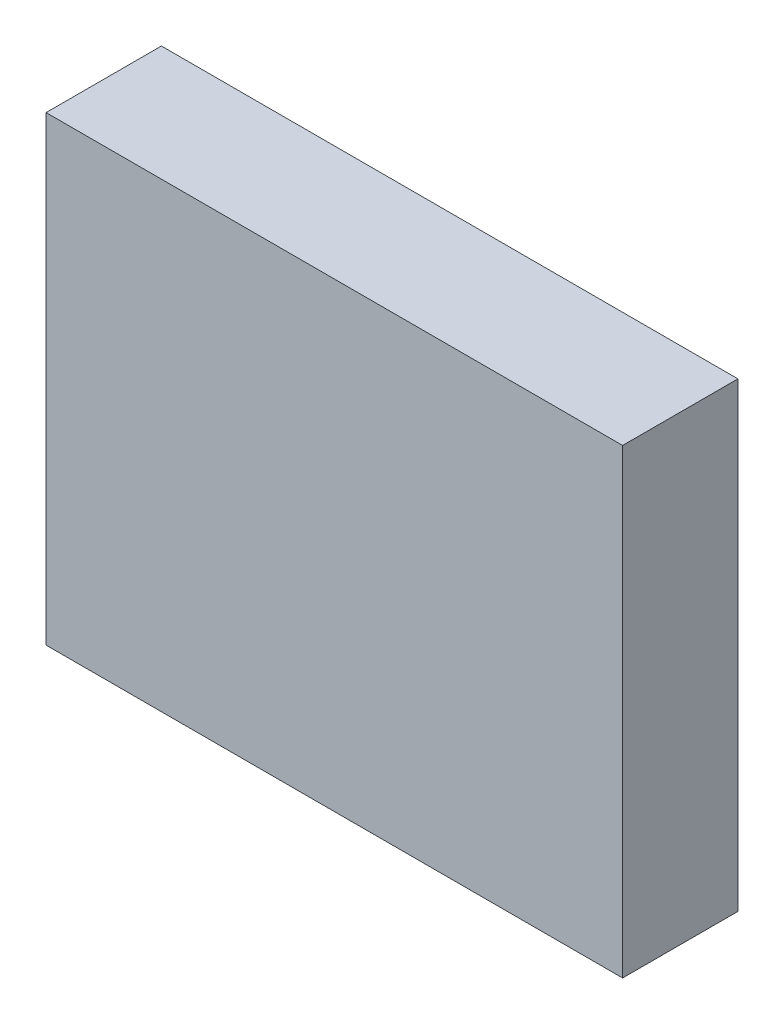
ISO-10303-21;
HEADER;
FILE_DESCRIPTION(('STEP AP214'),'2;1');
FILE_NAME('part.step','',(''),(''),'','','');
FILE_SCHEMA(('AUTOMOTIVE_DESIGN { 1 0 10303 214 1 1 1 1 }'));
ENDSEC;
DATA;
#1=APPLICATION_CONTEXT('core data for automotive mechanical design processes');
#2=APPLICATION_PROTOCOL_DEFINITION('international standard','automotive_design',2000,#1);
#3=PRODUCT_CONTEXT('',#1,'mechanical');
#4=PRODUCT('Part','Part','',(#3));
#5=PRODUCT_RELATED_PRODUCT_CATEGORY('part','',(#4));
#6=PRODUCT_DEFINITION_FORMATION('','',#4);
#7=PRODUCT_DEFINITION_CONTEXT('part definition',#1,'design');
#8=PRODUCT_DEFINITION('design','',#6,#7);
#9=PRODUCT_DEFINITION_SHAPE('','',#8);
#10=(LENGTH_UNIT() NAMED_UNIT(*) SI_UNIT(.MILLI.,.METRE.));
#11=(NAMED_UNIT(*) PLANE_ANGLE_UNIT() SI_UNIT($,.RADIAN.));
#12=(NAMED_UNIT(*) SI_UNIT($,.STERADIAN.) SOLID_ANGLE_UNIT());
#13=UNCERTAINTY_MEASURE_WITH_UNIT(LENGTH_MEASURE(1.E-05),#10,'distance_accuracy_value','');
#14=(GEOMETRIC_REPRESENTATION_CONTEXT(3) GLOBAL_UNCERTAINTY_ASSIGNED_CONTEXT((#13)) GLOBAL_UNIT_ASSIGNED_CONTEXT((#10,
#11,#12)) REPRESENTATION_CONTEXT('',''));
#15=CARTESIAN_POINT('',(0.,0.,0.));
#16=DIRECTION('',(0.,0.,1.));
#17=DIRECTION('',(1.,0.,0.));
#18=AXIS2_PLACEMENT_3D('',#15,#16,#17);
#19=CARTESIAN_POINT('',(0.,0.,100.));
#20=DIRECTION('',(1.,0.,0.));
#21=DIRECTION('',(0.,1.,0.));
#22=AXIS2_PLACEMENT_3D('',#19,#20,#21);
#23=PLANE('',#22);
#24=DIRECTION('',(0.,-1.,0.));
#25=VECTOR('',#24,1.);
#26=CARTESIAN_POINT('',(0.,0.,0.));
#27=LINE('',#26,#25);
#28=CARTESIAN_POINT('',(0.,0.,0.));
#29=VERTEX_POINT('',#28);
#30=CARTESIAN_POINT('',(0.,-400.,0.));
#31=VERTEX_POINT('',#30);
#32=EDGE_CURVE('E113',#29,#31,#27,.T.);
#33=ORIENTED_EDGE('',*,*,#32,.T.);
#34=DIRECTION('',(0.,0.,-1.));
#35=VECTOR('',#34,1.);
#36=CARTESIAN_POINT('',(0.,-400.,100.));
#37=LINE('',#36,#35);
#38=CARTESIAN_POINT('',(0.,-400.,100.));
#39=VERTEX_POINT('',#38);
#40=EDGE_CURVE('E11',#39,#31,#37,.T.);
#41=ORIENTED_EDGE('',*,*,#40,.F.);
#42=DIRECTION('',(0.,-1.,0.));
#43=VECTOR('',#42,1.);
#44=CARTESIAN_POINT('',(0.,0.,100.));
#45=LINE('',#44,#43);
#46=CARTESIAN_POINT('',(0.,0.,100.));
#47=VERTEX_POINT('',#46);
#48=EDGE_CURVE('E97',#47,#39,#45,.T.);
#49=ORIENTED_EDGE('',*,*,#48,.F.);
#50=DIRECTION('',(0.,0.,-1.));
#51=VECTOR('',#50,1.);
#52=CARTESIAN_POINT('',(0.,0.,100.));
#53=LINE('',#52,#51);
#54=EDGE_CURVE('E109',#47,#29,#53,.T.);
#55=ORIENTED_EDGE('',*,*,#54,.T.);
#56=EDGE_LOOP('',(#33,#41,#49,#55));
#57=FACE_BOUND('',#56,.T.);
#58=ADVANCED_FACE('F45',(#57),#23,.F.);
#59=CARTESIAN_POINT('',(0.,-400.,100.));
#60=DIRECTION('',(0.,1.,0.));
#61=DIRECTION('',(0.,0.,1.));
#62=AXIS2_PLACEMENT_3D('',#59,#60,#61);
#63=PLANE('',#62);
#64=DIRECTION('',(1.,0.,0.));
#65=VECTOR('',#64,1.);
#66=CARTESIAN_POINT('',(0.,-400.,0.));
#67=LINE('',#66,#65);
#68=CARTESIAN_POINT('',(500.,-400.,0.));
#69=VERTEX_POINT('',#68);
#70=EDGE_CURVE('E102',#31,#69,#67,.T.);
#71=ORIENTED_EDGE('',*,*,#70,.T.);
#72=DIRECTION('',(0.,0.,-1.));
#73=VECTOR('',#72,1.);
#74=CARTESIAN_POINT('',(500.,-400.,100.));
#75=LINE('',#74,#73);
#76=CARTESIAN_POINT('',(500.,-400.,100.));
#77=VERTEX_POINT('',#76);
#78=EDGE_CURVE('E54',#77,#69,#75,.T.);
#79=ORIENTED_EDGE('',*,*,#78,.F.);
#80=DIRECTION('',(1.,0.,0.));
#81=VECTOR('',#80,1.);
#82=CARTESIAN_POINT('',(0.,-400.,100.));
#83=LINE('',#82,#81);
#84=EDGE_CURVE('E92',#39,#77,#83,.T.);
#85=ORIENTED_EDGE('',*,*,#84,.F.);
#86=ORIENTED_EDGE('',*,*,#40,.T.);
#87=EDGE_LOOP('',(#71,#79,#85,#86));
#88=FACE_BOUND('',#87,.T.);
#89=ADVANCED_FACE('F101',(#88),#63,.F.);
#90=CARTESIAN_POINT('',(500.,0.,100.));
#91=DIRECTION('',(-1.,0.,0.));
#92=DIRECTION('',(0.,-1.,0.));
#93=AXIS2_PLACEMENT_3D('',#90,#91,#92);
#94=PLANE('',#93);
#95=DIRECTION('',(0.,1.,0.));
#96=VECTOR('',#95,1.);
#97=CARTESIAN_POINT('',(500.,0.,0.));
#98=LINE('',#97,#96);
#99=CARTESIAN_POINT('',(500.,0.,0.));
#100=VERTEX_POINT('',#99);
#101=EDGE_CURVE('E79',#69,#100,#98,.T.);
#102=ORIENTED_EDGE('',*,*,#101,.T.);
#103=DIRECTION('',(0.,0.,-1.));
#104=VECTOR('',#103,1.);
#105=CARTESIAN_POINT('',(500.,0.,100.));
#106=LINE('',#105,#104);
#107=CARTESIAN_POINT('',(500.,0.,100.));
#108=VERTEX_POINT('',#107);
#109=EDGE_CURVE('E104',#108,#100,#106,.T.);
#110=ORIENTED_EDGE('',*,*,#109,.F.);
#111=DIRECTION('',(0.,1.,0.));
#112=VECTOR('',#111,1.);
#113=CARTESIAN_POINT('',(500.,0.,100.));
#114=LINE('',#113,#112);
#115=EDGE_CURVE('E95',#77,#108,#114,.T.);
#116=ORIENTED_EDGE('',*,*,#115,.F.);
#117=ORIENTED_EDGE('',*,*,#78,.T.);
#118=EDGE_LOOP('',(#102,#110,#116,#117));
#119=FACE_BOUND('',#118,.T.);
#120=ADVANCED_FACE('F105',(#119),#94,.F.);
#121=CARTESIAN_POINT('',(0.,0.,100.));
#122=DIRECTION('',(0.,-1.,0.));
#123=DIRECTION('',(0.,0.,-1.));
#124=AXIS2_PLACEMENT_3D('',#121,#122,#123);
#125=PLANE('',#124);
#126=DIRECTION('',(-1.,0.,0.));
#127=VECTOR('',#126,1.);
#128=CARTESIAN_POINT('',(0.,0.,0.));
#129=LINE('',#128,#127);
#130=EDGE_CURVE('E85',#100,#29,#129,.T.);
#131=ORIENTED_EDGE('',*,*,#130,.T.);
#132=ORIENTED_EDGE('',*,*,#54,.F.);
#133=DIRECTION('',(-1.,0.,0.));
#134=VECTOR('',#133,1.);
#135=CARTESIAN_POINT('',(0.,0.,100.));
#136=LINE('',#135,#134);
#137=EDGE_CURVE('E62',#108,#47,#136,.T.);
#138=ORIENTED_EDGE('',*,*,#137,.F.);
#139=ORIENTED_EDGE('',*,*,#109,.T.);
#140=EDGE_LOOP('',(#131,#132,#138,#139));
#141=FACE_BOUND('',#140,.T.);
#142=ADVANCED_FACE('F126',(#141),#125,.F.);
#143=CARTESIAN_POINT('',(0.,0.,100.));
#144=DIRECTION('',(0.,0.,1.));
#145=DIRECTION('',(1.,0.,0.));
#146=AXIS2_PLACEMENT_3D('',#143,#144,#145);
#147=PLANE('',#146);
#148=ORIENTED_EDGE('',*,*,#48,.T.);
#149=ORIENTED_EDGE('',*,*,#84,.T.);
#150=ORIENTED_EDGE('',*,*,#115,.T.);
#151=ORIENTED_EDGE('',*,*,#137,.T.);
#152=EDGE_LOOP('',(#148,#149,#150,#151));
#153=FACE_BOUND('',#152,.T.);
#154=ADVANCED_FACE('F93',(#153),#147,.T.);
#155=CARTESIAN_POINT('',(0.,0.,0.));
#156=DIRECTION('',(0.,0.,1.));
#157=DIRECTION('',(1.,0.,0.));
#158=AXIS2_PLACEMENT_3D('',#155,#156,#157);
#159=PLANE('',#158);
#160=ORIENTED_EDGE('',*,*,#32,.F.);
#161=ORIENTED_EDGE('',*,*,#130,.F.);
#162=ORIENTED_EDGE('',*,*,#101,.F.);
#163=ORIENTED_EDGE('',*,*,#70,.F.);
#164=EDGE_LOOP('',(#160,#161,#162,#163));
#165=FACE_BOUND('',#164,.T.);
#166=ADVANCED_FACE('F129',(#165),#159,.F.);
#167=CLOSED_SHELL('',(#58,#89,#120,#142,#154,#166));
#168=MANIFOLD_SOLID_BREP('B2',#167);
#169=ADVANCED_BREP_SHAPE_REPRESENTATION('',(#18,#168),#14);
#170=SHAPE_DEFINITION_REPRESENTATION(#9,#169);
ENDSEC;
END-ISO-10303-21;
